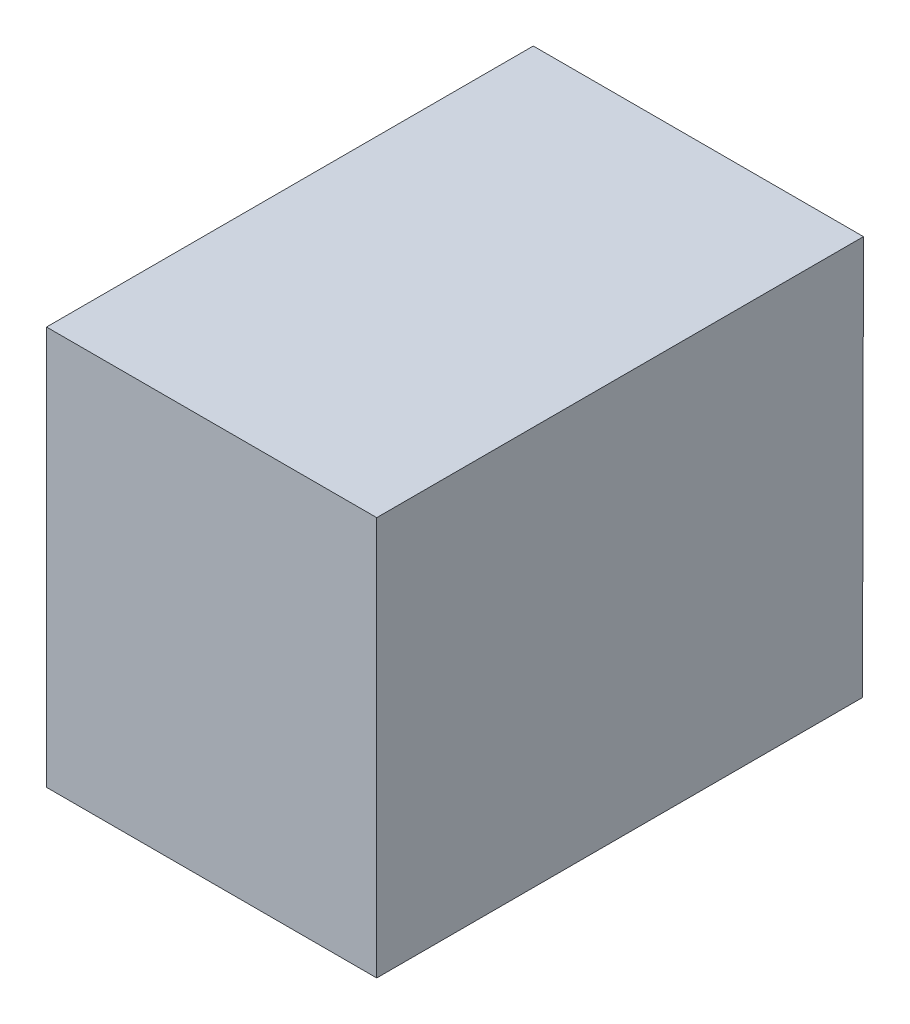
ISO-10303-21;
HEADER;
FILE_DESCRIPTION(('STEP AP214'),'2;1');
FILE_NAME('part.step','',(''),(''),'','','');
FILE_SCHEMA(('AUTOMOTIVE_DESIGN { 1 0 10303 214 1 1 1 1 }'));
ENDSEC;
DATA;
#1=APPLICATION_CONTEXT('core data for automotive mechanical design processes');
#2=APPLICATION_PROTOCOL_DEFINITION('international standard','automotive_design',2000,#1);
#3=PRODUCT_CONTEXT('',#1,'mechanical');
#4=PRODUCT('Part','Part','',(#3));
#5=PRODUCT_RELATED_PRODUCT_CATEGORY('part','',(#4));
#6=PRODUCT_DEFINITION_FORMATION('','',#4);
#7=PRODUCT_DEFINITION_CONTEXT('part definition',#1,'design');
#8=PRODUCT_DEFINITION('design','',#6,#7);
#9=PRODUCT_DEFINITION_SHAPE('','',#8);
#10=(LENGTH_UNIT() NAMED_UNIT(*) SI_UNIT(.MILLI.,.METRE.));
#11=(NAMED_UNIT(*) PLANE_ANGLE_UNIT() SI_UNIT($,.RADIAN.));
#12=(NAMED_UNIT(*) SI_UNIT($,.STERADIAN.) SOLID_ANGLE_UNIT());
#13=UNCERTAINTY_MEASURE_WITH_UNIT(LENGTH_MEASURE(1.E-05),#10,'distance_accuracy_value','');
#14=(GEOMETRIC_REPRESENTATION_CONTEXT(3) GLOBAL_UNCERTAINTY_ASSIGNED_CONTEXT((#13)) GLOBAL_UNIT_ASSIGNED_CONTEXT((#10,
#11,#12)) REPRESENTATION_CONTEXT('',''));
#15=CARTESIAN_POINT('',(0.,0.,0.));
#16=DIRECTION('',(0.,0.,1.));
#17=DIRECTION('',(1.,0.,0.));
#18=AXIS2_PLACEMENT_3D('',#15,#16,#17);
#19=CARTESIAN_POINT('',(-100.2,-54.,-68.8));
#20=DIRECTION('',(-1.,0.,0.));
#21=DIRECTION('',(0.,0.,1.));
#22=AXIS2_PLACEMENT_3D('',#19,#20,#21);
#23=PLANE('',#22);
#24=DIRECTION('',(0.,0.,1.));
#25=VECTOR('',#24,1.);
#26=CARTESIAN_POINT('',(-100.2,18.5600127582814,-9.836521772084));
#27=LINE('',#26,#25);
#28=CARTESIAN_POINT('',(-100.2,18.5600127582814,-12.7480051300562));
#29=VERTEX_POINT('',#28);
#30=CARTESIAN_POINT('',(-100.19999999985,18.5600127582814,-6.92509764655973));
#31=VERTEX_POINT('',#30);
#32=EDGE_CURVE('E61',#29,#31,#27,.T.);
#33=ORIENTED_EDGE('',*,*,#32,.F.);
#34=DIRECTION('',(0.,0.999997212561078,-0.00236111627691398));
#35=VECTOR('',#34,1.);
#36=CARTESIAN_POINT('',(-100.2,13.7905329643882,-12.7367438022921));
#37=LINE('',#36,#35);
#38=CARTESIAN_POINT('',(-100.2,13.7904891116241,-12.7367436987504));
#39=VERTEX_POINT('',#38);
#40=EDGE_CURVE('E20',#29,#39,#37,.F.);
#41=ORIENTED_EDGE('',*,*,#40,.T.);
#42=DIRECTION('',(0.,0.,1.));
#43=VECTOR('',#42,1.);
#44=CARTESIAN_POINT('',(-100.2,13.79048911212,-68.8));
#45=LINE('',#44,#43);
#46=CARTESIAN_POINT('',(-100.199999999775,13.790489111935,-6.92509764655973));
#47=VERTEX_POINT('',#46);
#48=EDGE_CURVE('E63',#39,#47,#45,.T.);
#49=ORIENTED_EDGE('',*,*,#48,.T.);
#50=DIRECTION('',(0.,1.,0.));
#51=VECTOR('',#50,1.);
#52=CARTESIAN_POINT('',(-100.199999999699,16.17527059579,-6.92509764655973));
#53=LINE('',#52,#51);
#54=EDGE_CURVE('E60',#31,#47,#53,.F.);
#55=ORIENTED_EDGE('',*,*,#54,.F.);
#56=EDGE_LOOP('',(#33,#41,#49,#55));
#57=FACE_BOUND('',#56,.T.);
#58=ADVANCED_FACE('F17',(#57),#23,.T.);
#59=CARTESIAN_POINT('',(-98.22492057205,16.17528411783,-12.74237449273));
#60=DIRECTION('',(-1.11961502637595E-11,0.00236111627691495,0.999997212561079));
#61=DIRECTION('',(0.,-0.999997212561079,0.00236111627691495));
#62=AXIS2_PLACEMENT_3D('',#59,#60,#61);
#63=PLANE('',#62);
#64=DIRECTION('',(0.,-0.999997212561079,0.00236111627691495));
#65=VECTOR('',#64,1.);
#66=CARTESIAN_POINT('',(-96.25,16.1752841178301,-12.7423744927079));
#67=LINE('',#66,#65);
#68=CARTESIAN_POINT('',(-96.2500000003121,18.5600654609782,-12.7480056739497));
#69=VERTEX_POINT('',#68);
#70=CARTESIAN_POINT('',(-96.25,13.79048911212,-12.7367436987073));
#71=VERTEX_POINT('',#70);
#72=EDGE_CURVE('E70',#69,#71,#67,.T.);
#73=ORIENTED_EDGE('',*,*,#72,.T.);
#74=DIRECTION('',(1.,0.,1.11961190551745E-11));
#75=VECTOR('',#74,1.);
#76=CARTESIAN_POINT('',(-98.22492057205,13.7904891111282,-12.7367436987271));
#77=LINE('',#76,#75);
#78=EDGE_CURVE('E78',#71,#39,#77,.F.);
#79=ORIENTED_EDGE('',*,*,#78,.T.);
#80=ORIENTED_EDGE('',*,*,#40,.F.);
#81=DIRECTION('',(-0.999999999910989,-1.33424548932599E-05,0.));
#82=VECTOR('',#81,1.);
#83=CARTESIAN_POINT('',(-98.22496925742,18.56003911004,-12.74800609345));
#84=LINE('',#83,#82);
#85=EDGE_CURVE('E69',#69,#29,#84,.T.);
#86=ORIENTED_EDGE('',*,*,#85,.F.);
#87=EDGE_LOOP('',(#73,#79,#80,#86));
#88=FACE_BOUND('',#87,.T.);
#89=ADVANCED_FACE('F80',(#88),#63,.F.);
#90=CARTESIAN_POINT('',(-98.225,13.79048911212,-9.830920278512));
#91=DIRECTION('',(0.,1.,0.));
#92=DIRECTION('',(0.,0.,1.));
#93=AXIS2_PLACEMENT_3D('',#90,#91,#92);
#94=PLANE('',#93);
#95=DIRECTION('',(0.,0.,1.));
#96=VECTOR('',#95,1.);
#97=CARTESIAN_POINT('',(-96.25,13.79048911212,-9.830920278512));
#98=LINE('',#97,#96);
#99=CARTESIAN_POINT('',(-96.25,13.7904891120275,-6.92509964944225));
#100=VERTEX_POINT('',#99);
#101=EDGE_CURVE('E85',#71,#100,#98,.T.);
#102=ORIENTED_EDGE('',*,*,#101,.T.);
#103=DIRECTION('',(0.999999999999864,0.,-5.21546269263581E-07));
#104=VECTOR('',#103,1.);
#105=CARTESIAN_POINT('',(-98.22499351073,13.79048911175,-6.925098676617));
#106=LINE('',#105,#104);
#107=EDGE_CURVE('E66',#47,#100,#106,.T.);
#108=ORIENTED_EDGE('',*,*,#107,.F.);
#109=ORIENTED_EDGE('',*,*,#48,.F.);
#110=ORIENTED_EDGE('',*,*,#78,.F.);
#111=EDGE_LOOP('',(#102,#108,#109,#110));
#112=FACE_BOUND('',#111,.T.);
#113=ADVANCED_FACE('F84',(#112),#94,.F.);
#114=CARTESIAN_POINT('',(-98.22499351073,16.17527059579,-6.925098676617));
#115=DIRECTION('',(5.21546269263581E-07,0.,0.999999999999864));
#116=DIRECTION('',(0.999999999999864,0.,-5.21546269263581E-07));
#117=AXIS2_PLACEMENT_3D('',#114,#115,#116);
#118=PLANE('',#117);
#119=DIRECTION('',(0.999999999910853,1.3342454893258E-05,-5.21546269217158E-07));
#120=VECTOR('',#119,1.);
#121=CARTESIAN_POINT('',(-98.2249677389781,18.5600391100603,-6.92509867663044));
#122=LINE('',#121,#120);
#123=CARTESIAN_POINT('',(-96.2500000004681,18.5600654609782,-6.92509964944225));
#124=VERTEX_POINT('',#123);
#125=EDGE_CURVE('E34',#31,#124,#122,.T.);
#126=ORIENTED_EDGE('',*,*,#125,.F.);
#127=ORIENTED_EDGE('',*,*,#54,.T.);
#128=ORIENTED_EDGE('',*,*,#107,.T.);
#129=DIRECTION('',(0.,1.,0.));
#130=VECTOR('',#129,1.);
#131=CARTESIAN_POINT('',(-96.25,-54.,-6.925099592217));
#132=LINE('',#131,#130);
#133=EDGE_CURVE('E26',#100,#124,#132,.T.);
#134=ORIENTED_EDGE('',*,*,#133,.T.);
#135=EDGE_LOOP('',(#126,#127,#128,#134));
#136=FACE_BOUND('',#135,.T.);
#137=ADVANCED_FACE('F73',(#136),#118,.T.);
#138=CARTESIAN_POINT('',(-98.22496925742,18.56003911004,-9.836521772084));
#139=DIRECTION('',(-1.33424548932599E-05,0.999999999910989,0.));
#140=DIRECTION('',(-0.999999999910989,-1.33424548932599E-05,0.));
#141=AXIS2_PLACEMENT_3D('',#138,#139,#140);
#142=PLANE('',#141);
#143=ORIENTED_EDGE('',*,*,#85,.T.);
#144=ORIENTED_EDGE('',*,*,#32,.T.);
#145=ORIENTED_EDGE('',*,*,#125,.T.);
#146=DIRECTION('',(0.,0.,1.));
#147=VECTOR('',#146,1.);
#148=CARTESIAN_POINT('',(-96.2500000006242,18.5600654609782,-9.836521772084));
#149=LINE('',#148,#147);
#150=EDGE_CURVE('E11',#124,#69,#149,.F.);
#151=ORIENTED_EDGE('',*,*,#150,.T.);
#152=EDGE_LOOP('',(#143,#144,#145,#151));
#153=FACE_BOUND('',#152,.T.);
#154=ADVANCED_FACE('F68',(#153),#142,.T.);
#155=CARTESIAN_POINT('',(-96.25,-54.,-68.8));
#156=DIRECTION('',(-1.,0.,0.));
#157=DIRECTION('',(0.,0.,1.));
#158=AXIS2_PLACEMENT_3D('',#155,#156,#157);
#159=PLANE('',#158);
#160=ORIENTED_EDGE('',*,*,#133,.F.);
#161=ORIENTED_EDGE('',*,*,#101,.F.);
#162=ORIENTED_EDGE('',*,*,#72,.F.);
#163=ORIENTED_EDGE('',*,*,#150,.F.);
#164=EDGE_LOOP('',(#160,#161,#162,#163));
#165=FACE_BOUND('',#164,.T.);
#166=ADVANCED_FACE('F87',(#165),#159,.F.);
#167=CLOSED_SHELL('',(#58,#89,#113,#137,#154,#166));
#168=MANIFOLD_SOLID_BREP('B1',#167);
#169=ADVANCED_BREP_SHAPE_REPRESENTATION('',(#18,#168),#14);
#170=SHAPE_DEFINITION_REPRESENTATION(#9,#169);
ENDSEC;
END-ISO-10303-21;
